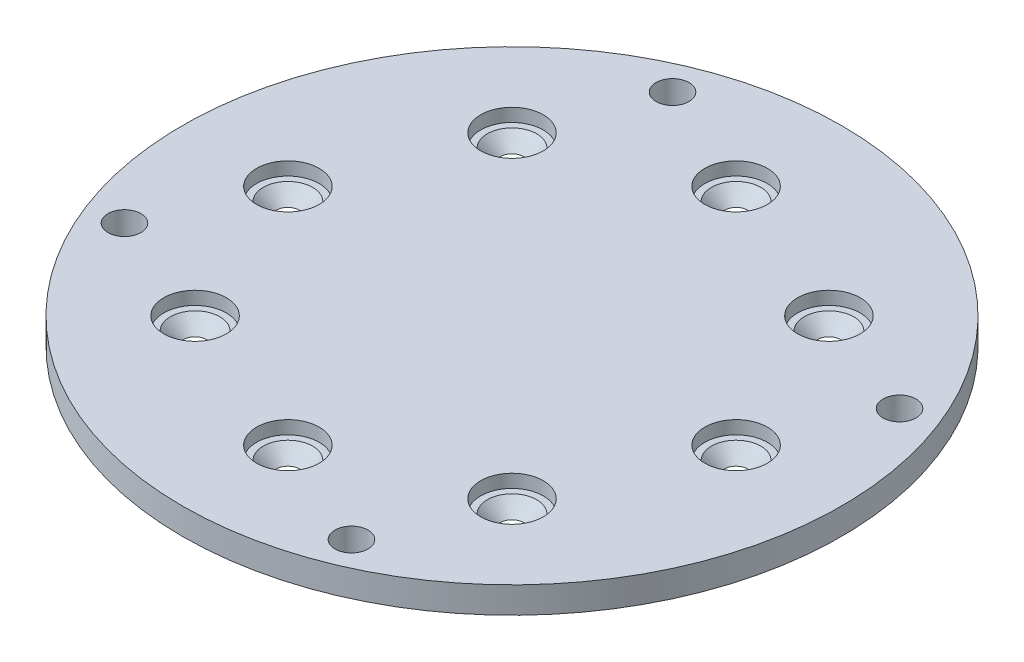
ISO-10303-21;
HEADER;
FILE_DESCRIPTION(('STEP AP214'),'2;1');
FILE_NAME('part.step','',(''),(''),'','','');
FILE_SCHEMA(('AUTOMOTIVE_DESIGN { 1 0 10303 214 1 1 1 1 }'));
ENDSEC;
DATA;
#1=APPLICATION_CONTEXT('core data for automotive mechanical design processes');
#2=APPLICATION_PROTOCOL_DEFINITION('international standard','automotive_design',2000,#1);
#3=PRODUCT_CONTEXT('',#1,'mechanical');
#4=PRODUCT('Part','Part','',(#3));
#5=PRODUCT_RELATED_PRODUCT_CATEGORY('part','',(#4));
#6=PRODUCT_DEFINITION_FORMATION('','',#4);
#7=PRODUCT_DEFINITION_CONTEXT('part definition',#1,'design');
#8=PRODUCT_DEFINITION('design','',#6,#7);
#9=PRODUCT_DEFINITION_SHAPE('','',#8);
#10=(LENGTH_UNIT() NAMED_UNIT(*) SI_UNIT(.MILLI.,.METRE.));
#11=(NAMED_UNIT(*) PLANE_ANGLE_UNIT() SI_UNIT($,.RADIAN.));
#12=(NAMED_UNIT(*) SI_UNIT($,.STERADIAN.) SOLID_ANGLE_UNIT());
#13=UNCERTAINTY_MEASURE_WITH_UNIT(LENGTH_MEASURE(1.E-05),#10,'distance_accuracy_value','');
#14=(GEOMETRIC_REPRESENTATION_CONTEXT(3) GLOBAL_UNCERTAINTY_ASSIGNED_CONTEXT((#13)) GLOBAL_UNIT_ASSIGNED_CONTEXT((#10,
#11,#12)) REPRESENTATION_CONTEXT('',''));
#15=CARTESIAN_POINT('',(0.,0.,0.));
#16=DIRECTION('',(0.,0.,1.));
#17=DIRECTION('',(1.,0.,0.));
#18=AXIS2_PLACEMENT_3D('',#15,#16,#17);
#19=CARTESIAN_POINT('',(0.,4.,0.));
#20=DIRECTION('',(0.,-1.,0.));
#21=DIRECTION('',(0.,0.,-1.));
#22=AXIS2_PLACEMENT_3D('',#19,#20,#21);
#23=PLANE('',#22);
#24=CARTESIAN_POINT('',(0.,4.,34.));
#25=DIRECTION('',(0.,1.,0.));
#26=DIRECTION('',(0.,0.,1.));
#27=AXIS2_PLACEMENT_3D('',#24,#25,#26);
#28=CIRCLE('',#27,4.75);
#29=CARTESIAN_POINT('',(0.,4.,38.75));
#30=VERTEX_POINT('',#29);
#31=EDGE_CURVE('E144',#30,#30,#28,.T.);
#32=ORIENTED_EDGE('',*,*,#31,.F.);
#33=EDGE_LOOP('',(#32));
#34=FACE_BOUND('',#33,.T.);
#35=CARTESIAN_POINT('',(0.,4.,-34.));
#36=DIRECTION('',(0.,1.,0.));
#37=DIRECTION('',(0.,0.,1.));
#38=AXIS2_PLACEMENT_3D('',#35,#36,#37);
#39=CIRCLE('',#38,4.75);
#40=CARTESIAN_POINT('',(0.,4.,-29.25));
#41=VERTEX_POINT('',#40);
#42=EDGE_CURVE('E157',#41,#41,#39,.T.);
#43=ORIENTED_EDGE('',*,*,#42,.F.);
#44=EDGE_LOOP('',(#43));
#45=FACE_BOUND('',#44,.T.);
#46=CARTESIAN_POINT('',(-24.0416305603426,4.,-24.0416305603426));
#47=DIRECTION('',(0.,1.,0.));
#48=DIRECTION('',(0.,0.,1.));
#49=AXIS2_PLACEMENT_3D('',#46,#47,#48);
#50=CIRCLE('',#49,4.75);
#51=CARTESIAN_POINT('',(-24.0416305603426,4.,-19.2916305603426));
#52=VERTEX_POINT('',#51);
#53=EDGE_CURVE('E163',#52,#52,#50,.T.);
#54=ORIENTED_EDGE('',*,*,#53,.F.);
#55=EDGE_LOOP('',(#54));
#56=FACE_BOUND('',#55,.T.);
#57=CARTESIAN_POINT('',(-34.,4.,0.));
#58=DIRECTION('',(0.,1.,0.));
#59=DIRECTION('',(0.,0.,1.));
#60=AXIS2_PLACEMENT_3D('',#57,#58,#59);
#61=CIRCLE('',#60,4.75);
#62=CARTESIAN_POINT('',(-34.,4.,4.75));
#63=VERTEX_POINT('',#62);
#64=EDGE_CURVE('E169',#63,#63,#61,.T.);
#65=ORIENTED_EDGE('',*,*,#64,.F.);
#66=EDGE_LOOP('',(#65));
#67=FACE_BOUND('',#66,.T.);
#68=CARTESIAN_POINT('',(24.0416305603426,4.,24.0416305603426));
#69=DIRECTION('',(0.,1.,0.));
#70=DIRECTION('',(0.,0.,1.));
#71=AXIS2_PLACEMENT_3D('',#68,#69,#70);
#72=CIRCLE('',#71,4.75);
#73=CARTESIAN_POINT('',(24.0416305603426,4.,28.7916305603426));
#74=VERTEX_POINT('',#73);
#75=EDGE_CURVE('E138',#74,#74,#72,.T.);
#76=ORIENTED_EDGE('',*,*,#75,.F.);
#77=EDGE_LOOP('',(#76));
#78=FACE_BOUND('',#77,.T.);
#79=CARTESIAN_POINT('',(34.,4.,0.));
#80=DIRECTION('',(0.,1.,0.));
#81=DIRECTION('',(0.,0.,1.));
#82=AXIS2_PLACEMENT_3D('',#79,#80,#81);
#83=CIRCLE('',#82,4.75);
#84=CARTESIAN_POINT('',(34.,4.,4.75));
#85=VERTEX_POINT('',#84);
#86=EDGE_CURVE('E131',#85,#85,#83,.T.);
#87=ORIENTED_EDGE('',*,*,#86,.F.);
#88=EDGE_LOOP('',(#87));
#89=FACE_BOUND('',#88,.T.);
#90=CARTESIAN_POINT('',(24.0416305603426,4.,-24.0416305603426));
#91=DIRECTION('',(0.,1.,0.));
#92=DIRECTION('',(0.,0.,1.));
#93=AXIS2_PLACEMENT_3D('',#90,#91,#92);
#94=CIRCLE('',#93,4.75);
#95=CARTESIAN_POINT('',(24.0416305603426,4.,-19.2916305603426));
#96=VERTEX_POINT('',#95);
#97=EDGE_CURVE('E152',#96,#96,#94,.T.);
#98=ORIENTED_EDGE('',*,*,#97,.F.);
#99=EDGE_LOOP('',(#98));
#100=FACE_BOUND('',#99,.T.);
#101=CARTESIAN_POINT('',(-24.0416305603426,4.,24.0416305603426));
#102=DIRECTION('',(0.,1.,0.));
#103=DIRECTION('',(0.,0.,1.));
#104=AXIS2_PLACEMENT_3D('',#101,#102,#103);
#105=CIRCLE('',#104,4.75);
#106=CARTESIAN_POINT('',(-24.0416305603426,4.,28.7916305603426));
#107=VERTEX_POINT('',#106);
#108=EDGE_CURVE('E145',#107,#107,#105,.T.);
#109=ORIENTED_EDGE('',*,*,#108,.F.);
#110=EDGE_LOOP('',(#109));
#111=FACE_BOUND('',#110,.T.);
#112=CARTESIAN_POINT('',(17.2207544564314,4.,41.574578963007));
#113=DIRECTION('',(0.,1.,0.));
#114=DIRECTION('',(0.,0.,1.));
#115=AXIS2_PLACEMENT_3D('',#112,#113,#114);
#116=CIRCLE('',#115,2.50000000000286);
#117=CARTESIAN_POINT('',(17.2207544564314,4.,44.0745789630098));
#118=VERTEX_POINT('',#117);
#119=EDGE_CURVE('E90',#118,#118,#116,.T.);
#120=ORIENTED_EDGE('',*,*,#119,.F.);
#121=EDGE_LOOP('',(#120));
#122=FACE_BOUND('',#121,.T.);
#123=CARTESIAN_POINT('',(-41.5745789630062,4.,17.2207544564298));
#124=DIRECTION('',(0.,1.,0.));
#125=DIRECTION('',(0.,0.,1.));
#126=AXIS2_PLACEMENT_3D('',#123,#124,#125);
#127=CIRCLE('',#126,2.50000000000164);
#128=CARTESIAN_POINT('',(-41.5745789630062,4.,19.7207544564314));
#129=VERTEX_POINT('',#128);
#130=EDGE_CURVE('E126',#129,#129,#127,.T.);
#131=ORIENTED_EDGE('',*,*,#130,.F.);
#132=EDGE_LOOP('',(#131));
#133=FACE_BOUND('',#132,.T.);
#134=CARTESIAN_POINT('',(41.5745789630086,4.,-17.2207544564307));
#135=DIRECTION('',(0.,1.,0.));
#136=DIRECTION('',(0.,0.,1.));
#137=AXIS2_PLACEMENT_3D('',#134,#135,#136);
#138=CIRCLE('',#137,2.50000000000153);
#139=CARTESIAN_POINT('',(41.5745789630086,4.,-14.7207544564292));
#140=VERTEX_POINT('',#139);
#141=EDGE_CURVE('E122',#140,#140,#138,.T.);
#142=ORIENTED_EDGE('',*,*,#141,.F.);
#143=EDGE_LOOP('',(#142));
#144=FACE_BOUND('',#143,.T.);
#145=CARTESIAN_POINT('',(-17.2207544564291,4.,-41.5745789630079));
#146=DIRECTION('',(0.,1.,0.));
#147=DIRECTION('',(0.,0.,1.));
#148=AXIS2_PLACEMENT_3D('',#145,#146,#147);
#149=CIRCLE('',#148,2.5);
#150=CARTESIAN_POINT('',(-17.2207544564291,4.,-39.0745789630079));
#151=VERTEX_POINT('',#150);
#152=EDGE_CURVE('E119',#151,#151,#149,.T.);
#153=ORIENTED_EDGE('',*,*,#152,.F.);
#154=EDGE_LOOP('',(#153));
#155=FACE_BOUND('',#154,.T.);
#156=CARTESIAN_POINT('',(0.,4.,0.));
#157=DIRECTION('',(0.,1.,0.));
#158=DIRECTION('',(0.,0.,1.));
#159=AXIS2_PLACEMENT_3D('',#156,#157,#158);
#160=CIRCLE('',#159,50.);
#161=CARTESIAN_POINT('',(0.,4.,50.));
#162=VERTEX_POINT('',#161);
#163=EDGE_CURVE('E80',#162,#162,#160,.T.);
#164=ORIENTED_EDGE('',*,*,#163,.T.);
#165=EDGE_LOOP('',(#164));
#166=FACE_BOUND('',#165,.T.);
#167=ADVANCED_FACE('F43',(#34,#45,#56,#67,#78,#89,#100,#111,#122,#133,#144,#155,#166),#23,.F.);
#168=CARTESIAN_POINT('',(0.,0.,0.));
#169=DIRECTION('',(0.,-1.,0.));
#170=DIRECTION('',(0.,0.,-1.));
#171=AXIS2_PLACEMENT_3D('',#168,#169,#170);
#172=PLANE('',#171);
#173=CARTESIAN_POINT('',(17.2207544564314,0.,41.574578963007));
#174=DIRECTION('',(0.,-1.,0.));
#175=DIRECTION('',(0.,0.,-1.));
#176=AXIS2_PLACEMENT_3D('',#173,#174,#175);
#177=CIRCLE('',#176,2.50000000000286);
#178=CARTESIAN_POINT('',(17.2207544564314,0.,39.0745789630041));
#179=VERTEX_POINT('',#178);
#180=EDGE_CURVE('E77',#179,#179,#177,.T.);
#181=ORIENTED_EDGE('',*,*,#180,.F.);
#182=EDGE_LOOP('',(#181));
#183=FACE_BOUND('',#182,.T.);
#184=CARTESIAN_POINT('',(-41.5745789630062,0.,17.2207544564298));
#185=DIRECTION('',(0.,-1.,0.));
#186=DIRECTION('',(0.,0.,-1.));
#187=AXIS2_PLACEMENT_3D('',#184,#185,#186);
#188=CIRCLE('',#187,2.50000000000164);
#189=CARTESIAN_POINT('',(-41.5745789630062,0.,14.7207544564281));
#190=VERTEX_POINT('',#189);
#191=EDGE_CURVE('E81',#190,#190,#188,.T.);
#192=ORIENTED_EDGE('',*,*,#191,.F.);
#193=EDGE_LOOP('',(#192));
#194=FACE_BOUND('',#193,.T.);
#195=CARTESIAN_POINT('',(41.5745789630086,0.,-17.2207544564307));
#196=DIRECTION('',(0.,-1.,0.));
#197=DIRECTION('',(0.,0.,-1.));
#198=AXIS2_PLACEMENT_3D('',#195,#196,#197);
#199=CIRCLE('',#198,2.50000000000153);
#200=CARTESIAN_POINT('',(41.5745789630086,0.,-19.7207544564323));
#201=VERTEX_POINT('',#200);
#202=EDGE_CURVE('E84',#201,#201,#199,.T.);
#203=ORIENTED_EDGE('',*,*,#202,.F.);
#204=EDGE_LOOP('',(#203));
#205=FACE_BOUND('',#204,.T.);
#206=CARTESIAN_POINT('',(-17.2207544564291,0.,-41.5745789630079));
#207=DIRECTION('',(0.,-1.,0.));
#208=DIRECTION('',(0.,0.,-1.));
#209=AXIS2_PLACEMENT_3D('',#206,#207,#208);
#210=CIRCLE('',#209,2.5);
#211=CARTESIAN_POINT('',(-17.2207544564291,0.,-44.0745789630079));
#212=VERTEX_POINT('',#211);
#213=EDGE_CURVE('E87',#212,#212,#210,.T.);
#214=ORIENTED_EDGE('',*,*,#213,.F.);
#215=EDGE_LOOP('',(#214));
#216=FACE_BOUND('',#215,.T.);
#217=CARTESIAN_POINT('',(-34.,0.,0.));
#218=DIRECTION('',(0.,-1.,0.));
#219=DIRECTION('',(0.,0.,-1.));
#220=AXIS2_PLACEMENT_3D('',#217,#218,#219);
#221=CIRCLE('',#220,1.75);
#222=CARTESIAN_POINT('',(-34.,0.,-1.75));
#223=VERTEX_POINT('',#222);
#224=EDGE_CURVE('E93',#223,#223,#221,.T.);
#225=ORIENTED_EDGE('',*,*,#224,.F.);
#226=EDGE_LOOP('',(#225));
#227=FACE_BOUND('',#226,.T.);
#228=CARTESIAN_POINT('',(24.0416305603426,0.,-24.0416305603426));
#229=DIRECTION('',(0.,-1.,0.));
#230=DIRECTION('',(0.,0.,-1.));
#231=AXIS2_PLACEMENT_3D('',#228,#229,#230);
#232=CIRCLE('',#231,1.75);
#233=CARTESIAN_POINT('',(24.0416305603426,0.,-25.7916305603426));
#234=VERTEX_POINT('',#233);
#235=EDGE_CURVE('E96',#234,#234,#232,.T.);
#236=ORIENTED_EDGE('',*,*,#235,.F.);
#237=EDGE_LOOP('',(#236));
#238=FACE_BOUND('',#237,.T.);
#239=CARTESIAN_POINT('',(0.,0.,-34.));
#240=DIRECTION('',(0.,-1.,0.));
#241=DIRECTION('',(0.,0.,-1.));
#242=AXIS2_PLACEMENT_3D('',#239,#240,#241);
#243=CIRCLE('',#242,1.75);
#244=CARTESIAN_POINT('',(0.,0.,-35.75));
#245=VERTEX_POINT('',#244);
#246=EDGE_CURVE('E99',#245,#245,#243,.T.);
#247=ORIENTED_EDGE('',*,*,#246,.F.);
#248=EDGE_LOOP('',(#247));
#249=FACE_BOUND('',#248,.T.);
#250=CARTESIAN_POINT('',(-24.0416305603426,0.,-24.0416305603426));
#251=DIRECTION('',(0.,-1.,0.));
#252=DIRECTION('',(0.,0.,-1.));
#253=AXIS2_PLACEMENT_3D('',#250,#251,#252);
#254=CIRCLE('',#253,1.75);
#255=CARTESIAN_POINT('',(-24.0416305603426,0.,-25.7916305603426));
#256=VERTEX_POINT('',#255);
#257=EDGE_CURVE('E102',#256,#256,#254,.T.);
#258=ORIENTED_EDGE('',*,*,#257,.F.);
#259=EDGE_LOOP('',(#258));
#260=FACE_BOUND('',#259,.T.);
#261=CARTESIAN_POINT('',(34.,0.,0.));
#262=DIRECTION('',(0.,-1.,0.));
#263=DIRECTION('',(0.,0.,-1.));
#264=AXIS2_PLACEMENT_3D('',#261,#262,#263);
#265=CIRCLE('',#264,1.75);
#266=CARTESIAN_POINT('',(34.,0.,-1.75000000000001));
#267=VERTEX_POINT('',#266);
#268=EDGE_CURVE('E105',#267,#267,#265,.T.);
#269=ORIENTED_EDGE('',*,*,#268,.F.);
#270=EDGE_LOOP('',(#269));
#271=FACE_BOUND('',#270,.T.);
#272=CARTESIAN_POINT('',(24.0416305603426,0.,24.0416305603426));
#273=DIRECTION('',(0.,-1.,0.));
#274=DIRECTION('',(0.,0.,-1.));
#275=AXIS2_PLACEMENT_3D('',#272,#273,#274);
#276=CIRCLE('',#275,1.75);
#277=CARTESIAN_POINT('',(24.0416305603426,0.,22.2916305603426));
#278=VERTEX_POINT('',#277);
#279=EDGE_CURVE('E108',#278,#278,#276,.T.);
#280=ORIENTED_EDGE('',*,*,#279,.F.);
#281=EDGE_LOOP('',(#280));
#282=FACE_BOUND('',#281,.T.);
#283=CARTESIAN_POINT('',(0.,0.,34.));
#284=DIRECTION('',(0.,-1.,0.));
#285=DIRECTION('',(0.,0.,-1.));
#286=AXIS2_PLACEMENT_3D('',#283,#284,#285);
#287=CIRCLE('',#286,1.75);
#288=CARTESIAN_POINT('',(0.,0.,32.25));
#289=VERTEX_POINT('',#288);
#290=EDGE_CURVE('E111',#289,#289,#287,.T.);
#291=ORIENTED_EDGE('',*,*,#290,.F.);
#292=EDGE_LOOP('',(#291));
#293=FACE_BOUND('',#292,.T.);
#294=CARTESIAN_POINT('',(-24.0416305603426,0.,24.0416305603426));
#295=DIRECTION('',(0.,-1.,0.));
#296=DIRECTION('',(0.,0.,-1.));
#297=AXIS2_PLACEMENT_3D('',#294,#295,#296);
#298=CIRCLE('',#297,1.75);
#299=CARTESIAN_POINT('',(-24.0416305603426,0.,22.2916305603426));
#300=VERTEX_POINT('',#299);
#301=EDGE_CURVE('E114',#300,#300,#298,.T.);
#302=ORIENTED_EDGE('',*,*,#301,.F.);
#303=EDGE_LOOP('',(#302));
#304=FACE_BOUND('',#303,.T.);
#305=CARTESIAN_POINT('',(0.,0.,0.));
#306=DIRECTION('',(0.,-1.,0.));
#307=DIRECTION('',(0.,0.,-1.));
#308=AXIS2_PLACEMENT_3D('',#305,#306,#307);
#309=CIRCLE('',#308,50.);
#310=CARTESIAN_POINT('',(0.,0.,-50.));
#311=VERTEX_POINT('',#310);
#312=EDGE_CURVE('E76',#311,#311,#309,.T.);
#313=ORIENTED_EDGE('',*,*,#312,.T.);
#314=EDGE_LOOP('',(#313));
#315=FACE_BOUND('',#314,.T.);
#316=ADVANCED_FACE('F190',(#183,#194,#205,#216,#227,#238,#249,#260,#271,#282,#293,#304,#315),
#172,.T.);
#317=CARTESIAN_POINT('',(0.,-6.,0.));
#318=DIRECTION('',(0.,1.,0.));
#319=DIRECTION('',(0.,0.,1.));
#320=AXIS2_PLACEMENT_3D('',#317,#318,#319);
#321=CYLINDRICAL_SURFACE('',#320,50.);
#322=ORIENTED_EDGE('',*,*,#163,.F.);
#323=EDGE_LOOP('',(#322));
#324=FACE_BOUND('',#323,.T.);
#325=ORIENTED_EDGE('',*,*,#312,.F.);
#326=EDGE_LOOP('',(#325));
#327=FACE_BOUND('',#326,.T.);
#328=ADVANCED_FACE('F216',(#324,#327),#321,.T.);
#329=CARTESIAN_POINT('',(-17.2207544564291,-6.,-41.5745789630079));
#330=DIRECTION('',(0.,1.,0.));
#331=DIRECTION('',(0.,0.,1.));
#332=AXIS2_PLACEMENT_3D('',#329,#330,#331);
#333=CYLINDRICAL_SURFACE('',#332,2.5);
#334=ORIENTED_EDGE('',*,*,#213,.T.);
#335=EDGE_LOOP('',(#334));
#336=FACE_BOUND('',#335,.T.);
#337=ORIENTED_EDGE('',*,*,#152,.T.);
#338=EDGE_LOOP('',(#337));
#339=FACE_BOUND('',#338,.T.);
#340=ADVANCED_FACE('F219',(#336,#339),#333,.F.);
#341=CARTESIAN_POINT('',(41.5745789630086,-6.,-17.2207544564307));
#342=DIRECTION('',(0.,1.,0.));
#343=DIRECTION('',(0.,0.,1.));
#344=AXIS2_PLACEMENT_3D('',#341,#342,#343);
#345=CYLINDRICAL_SURFACE('',#344,2.50000000000153);
#346=ORIENTED_EDGE('',*,*,#202,.T.);
#347=EDGE_LOOP('',(#346));
#348=FACE_BOUND('',#347,.T.);
#349=ORIENTED_EDGE('',*,*,#141,.T.);
#350=EDGE_LOOP('',(#349));
#351=FACE_BOUND('',#350,.T.);
#352=ADVANCED_FACE('F334',(#348,#351),#345,.F.);
#353=CARTESIAN_POINT('',(-41.5745789630062,-6.,17.2207544564298));
#354=DIRECTION('',(0.,1.,0.));
#355=DIRECTION('',(0.,0.,1.));
#356=AXIS2_PLACEMENT_3D('',#353,#354,#355);
#357=CYLINDRICAL_SURFACE('',#356,2.50000000000164);
#358=ORIENTED_EDGE('',*,*,#191,.T.);
#359=EDGE_LOOP('',(#358));
#360=FACE_BOUND('',#359,.T.);
#361=ORIENTED_EDGE('',*,*,#130,.T.);
#362=EDGE_LOOP('',(#361));
#363=FACE_BOUND('',#362,.T.);
#364=ADVANCED_FACE('F330',(#360,#363),#357,.F.);
#365=CARTESIAN_POINT('',(17.2207544564314,-6.,41.574578963007));
#366=DIRECTION('',(0.,1.,0.));
#367=DIRECTION('',(0.,0.,1.));
#368=AXIS2_PLACEMENT_3D('',#365,#366,#367);
#369=CYLINDRICAL_SURFACE('',#368,2.50000000000286);
#370=ORIENTED_EDGE('',*,*,#180,.T.);
#371=EDGE_LOOP('',(#370));
#372=FACE_BOUND('',#371,.T.);
#373=ORIENTED_EDGE('',*,*,#119,.T.);
#374=EDGE_LOOP('',(#373));
#375=FACE_BOUND('',#374,.T.);
#376=ADVANCED_FACE('F326',(#372,#375),#369,.F.);
#377=CARTESIAN_POINT('',(-34.,2.,0.));
#378=DIRECTION('',(0.,1.,0.));
#379=DIRECTION('',(0.,0.,1.));
#380=AXIS2_PLACEMENT_3D('',#377,#378,#379);
#381=PLANE('',#380);
#382=CARTESIAN_POINT('',(-34.,2.,0.));
#383=DIRECTION('',(0.,1.,0.));
#384=DIRECTION('',(0.,0.,1.));
#385=AXIS2_PLACEMENT_3D('',#382,#383,#384);
#386=CIRCLE('',#385,3.75000000000003);
#387=CARTESIAN_POINT('',(-34.,2.,3.75000000000003));
#388=VERTEX_POINT('',#387);
#389=EDGE_CURVE('E12',#388,#388,#386,.F.);
#390=ORIENTED_EDGE('',*,*,#389,.T.);
#391=EDGE_LOOP('',(#390));
#392=FACE_BOUND('',#391,.T.);
#393=CARTESIAN_POINT('',(-34.,2.,0.));
#394=DIRECTION('',(0.,1.,0.));
#395=DIRECTION('',(0.,0.,1.));
#396=AXIS2_PLACEMENT_3D('',#393,#394,#395);
#397=CIRCLE('',#396,4.75);
#398=CARTESIAN_POINT('',(-34.,2.,4.75));
#399=VERTEX_POINT('',#398);
#400=EDGE_CURVE('E149',#399,#399,#397,.T.);
#401=ORIENTED_EDGE('',*,*,#400,.T.);
#402=EDGE_LOOP('',(#401));
#403=FACE_BOUND('',#402,.T.);
#404=ADVANCED_FACE('F329',(#392,#403),#381,.T.);
#405=CARTESIAN_POINT('',(-34.,2.,0.));
#406=DIRECTION('',(0.,1.,0.));
#407=DIRECTION('',(0.,0.,1.));
#408=AXIS2_PLACEMENT_3D('',#405,#406,#407);
#409=CYLINDRICAL_SURFACE('',#408,4.75);
#410=ORIENTED_EDGE('',*,*,#400,.F.);
#411=EDGE_LOOP('',(#410));
#412=FACE_BOUND('',#411,.T.);
#413=ORIENTED_EDGE('',*,*,#64,.T.);
#414=EDGE_LOOP('',(#413));
#415=FACE_BOUND('',#414,.T.);
#416=ADVANCED_FACE('F375',(#412,#415),#409,.F.);
#417=CARTESIAN_POINT('',(24.0416305603426,2.,-24.0416305603426));
#418=DIRECTION('',(0.,1.,0.));
#419=DIRECTION('',(0.,0.,1.));
#420=AXIS2_PLACEMENT_3D('',#417,#418,#419);
#421=PLANE('',#420);
#422=CARTESIAN_POINT('',(24.0416305603426,2.,-24.0416305603426));
#423=DIRECTION('',(0.,1.,0.));
#424=DIRECTION('',(0.,0.,1.));
#425=AXIS2_PLACEMENT_3D('',#422,#423,#424);
#426=CIRCLE('',#425,3.74999999999999);
#427=CARTESIAN_POINT('',(24.0416305603426,2.,-20.2916305603426));
#428=VERTEX_POINT('',#427);
#429=EDGE_CURVE('E70',#428,#428,#426,.F.);
#430=ORIENTED_EDGE('',*,*,#429,.T.);
#431=EDGE_LOOP('',(#430));
#432=FACE_BOUND('',#431,.T.);
#433=CARTESIAN_POINT('',(24.0416305603426,2.,-24.0416305603426));
#434=DIRECTION('',(0.,1.,0.));
#435=DIRECTION('',(0.,0.,1.));
#436=AXIS2_PLACEMENT_3D('',#433,#434,#435);
#437=CIRCLE('',#436,4.75);
#438=CARTESIAN_POINT('',(24.0416305603426,2.,-19.2916305603426));
#439=VERTEX_POINT('',#438);
#440=EDGE_CURVE('E135',#439,#439,#437,.T.);
#441=ORIENTED_EDGE('',*,*,#440,.T.);
#442=EDGE_LOOP('',(#441));
#443=FACE_BOUND('',#442,.T.);
#444=ADVANCED_FACE('F373',(#432,#443),#421,.T.);
#445=CARTESIAN_POINT('',(24.0416305603426,2.,-24.0416305603426));
#446=DIRECTION('',(0.,1.,0.));
#447=DIRECTION('',(0.,0.,1.));
#448=AXIS2_PLACEMENT_3D('',#445,#446,#447);
#449=CYLINDRICAL_SURFACE('',#448,4.75);
#450=ORIENTED_EDGE('',*,*,#440,.F.);
#451=EDGE_LOOP('',(#450));
#452=FACE_BOUND('',#451,.T.);
#453=ORIENTED_EDGE('',*,*,#97,.T.);
#454=EDGE_LOOP('',(#453));
#455=FACE_BOUND('',#454,.T.);
#456=ADVANCED_FACE('F359',(#452,#455),#449,.F.);
#457=CARTESIAN_POINT('',(0.,2.,-34.));
#458=DIRECTION('',(0.,1.,0.));
#459=DIRECTION('',(0.,0.,1.));
#460=AXIS2_PLACEMENT_3D('',#457,#458,#459);
#461=PLANE('',#460);
#462=CARTESIAN_POINT('',(0.,2.,-34.));
#463=DIRECTION('',(0.,1.,0.));
#464=DIRECTION('',(0.,0.,1.));
#465=AXIS2_PLACEMENT_3D('',#462,#463,#464);
#466=CIRCLE('',#465,3.74999999999999);
#467=CARTESIAN_POINT('',(0.,2.,-30.25));
#468=VERTEX_POINT('',#467);
#469=EDGE_CURVE('E73',#468,#468,#466,.F.);
#470=ORIENTED_EDGE('',*,*,#469,.T.);
#471=EDGE_LOOP('',(#470));
#472=FACE_BOUND('',#471,.T.);
#473=CARTESIAN_POINT('',(0.,2.,-34.));
#474=DIRECTION('',(0.,1.,0.));
#475=DIRECTION('',(0.,0.,1.));
#476=AXIS2_PLACEMENT_3D('',#473,#474,#475);
#477=CIRCLE('',#476,4.75);
#478=CARTESIAN_POINT('',(0.,2.,-29.25));
#479=VERTEX_POINT('',#478);
#480=EDGE_CURVE('E160',#479,#479,#477,.T.);
#481=ORIENTED_EDGE('',*,*,#480,.T.);
#482=EDGE_LOOP('',(#481));
#483=FACE_BOUND('',#482,.T.);
#484=ADVANCED_FACE('F355',(#472,#483),#461,.T.);
#485=CARTESIAN_POINT('',(0.,2.,-34.));
#486=DIRECTION('',(0.,1.,0.));
#487=DIRECTION('',(0.,0.,1.));
#488=AXIS2_PLACEMENT_3D('',#485,#486,#487);
#489=CYLINDRICAL_SURFACE('',#488,4.75);
#490=ORIENTED_EDGE('',*,*,#480,.F.);
#491=EDGE_LOOP('',(#490));
#492=FACE_BOUND('',#491,.T.);
#493=ORIENTED_EDGE('',*,*,#42,.T.);
#494=EDGE_LOOP('',(#493));
#495=FACE_BOUND('',#494,.T.);
#496=ADVANCED_FACE('F358',(#492,#495),#489,.F.);
#497=CARTESIAN_POINT('',(-24.0416305603426,2.,-24.0416305603426));
#498=DIRECTION('',(0.,1.,0.));
#499=DIRECTION('',(0.,0.,1.));
#500=AXIS2_PLACEMENT_3D('',#497,#498,#499);
#501=PLANE('',#500);
#502=CARTESIAN_POINT('',(-24.0416305603426,2.,-24.0416305603426));
#503=DIRECTION('',(0.,1.,0.));
#504=DIRECTION('',(0.,0.,1.));
#505=AXIS2_PLACEMENT_3D('',#502,#503,#504);
#506=CIRCLE('',#505,3.74999999999999);
#507=CARTESIAN_POINT('',(-24.0416305603426,2.,-20.2916305603426));
#508=VERTEX_POINT('',#507);
#509=EDGE_CURVE('E51',#508,#508,#506,.F.);
#510=ORIENTED_EDGE('',*,*,#509,.T.);
#511=EDGE_LOOP('',(#510));
#512=FACE_BOUND('',#511,.T.);
#513=CARTESIAN_POINT('',(-24.0416305603426,2.,-24.0416305603426));
#514=DIRECTION('',(0.,1.,0.));
#515=DIRECTION('',(0.,0.,1.));
#516=AXIS2_PLACEMENT_3D('',#513,#514,#515);
#517=CIRCLE('',#516,4.75);
#518=CARTESIAN_POINT('',(-24.0416305603426,2.,-19.2916305603426));
#519=VERTEX_POINT('',#518);
#520=EDGE_CURVE('E166',#519,#519,#517,.T.);
#521=ORIENTED_EDGE('',*,*,#520,.T.);
#522=EDGE_LOOP('',(#521));
#523=FACE_BOUND('',#522,.T.);
#524=ADVANCED_FACE('F365',(#512,#523),#501,.T.);
#525=CARTESIAN_POINT('',(-24.0416305603426,2.,-24.0416305603426));
#526=DIRECTION('',(0.,1.,0.));
#527=DIRECTION('',(0.,0.,1.));
#528=AXIS2_PLACEMENT_3D('',#525,#526,#527);
#529=CYLINDRICAL_SURFACE('',#528,4.75);
#530=ORIENTED_EDGE('',*,*,#520,.F.);
#531=EDGE_LOOP('',(#530));
#532=FACE_BOUND('',#531,.T.);
#533=ORIENTED_EDGE('',*,*,#53,.T.);
#534=EDGE_LOOP('',(#533));
#535=FACE_BOUND('',#534,.T.);
#536=ADVANCED_FACE('F321',(#532,#535),#529,.F.);
#537=CARTESIAN_POINT('',(34.,2.,0.));
#538=DIRECTION('',(0.,1.,0.));
#539=DIRECTION('',(0.,0.,1.));
#540=AXIS2_PLACEMENT_3D('',#537,#538,#539);
#541=PLANE('',#540);
#542=CARTESIAN_POINT('',(34.,2.,0.));
#543=DIRECTION('',(0.,1.,0.));
#544=DIRECTION('',(0.,0.,1.));
#545=AXIS2_PLACEMENT_3D('',#542,#543,#544);
#546=CIRCLE('',#545,3.75000000000003);
#547=CARTESIAN_POINT('',(34.,2.,3.75000000000003));
#548=VERTEX_POINT('',#547);
#549=EDGE_CURVE('E67',#548,#548,#546,.F.);
#550=ORIENTED_EDGE('',*,*,#549,.T.);
#551=EDGE_LOOP('',(#550));
#552=FACE_BOUND('',#551,.T.);
#553=CARTESIAN_POINT('',(34.,2.,0.));
#554=DIRECTION('',(0.,1.,0.));
#555=DIRECTION('',(0.,0.,1.));
#556=AXIS2_PLACEMENT_3D('',#553,#554,#555);
#557=CIRCLE('',#556,4.75);
#558=CARTESIAN_POINT('',(34.,2.,4.75));
#559=VERTEX_POINT('',#558);
#560=EDGE_CURVE('E134',#559,#559,#557,.T.);
#561=ORIENTED_EDGE('',*,*,#560,.T.);
#562=EDGE_LOOP('',(#561));
#563=FACE_BOUND('',#562,.T.);
#564=ADVANCED_FACE('F318',(#552,#563),#541,.T.);
#565=CARTESIAN_POINT('',(34.,2.,0.));
#566=DIRECTION('',(0.,1.,0.));
#567=DIRECTION('',(0.,0.,1.));
#568=AXIS2_PLACEMENT_3D('',#565,#566,#567);
#569=CYLINDRICAL_SURFACE('',#568,4.75);
#570=ORIENTED_EDGE('',*,*,#560,.F.);
#571=EDGE_LOOP('',(#570));
#572=FACE_BOUND('',#571,.T.);
#573=ORIENTED_EDGE('',*,*,#86,.T.);
#574=EDGE_LOOP('',(#573));
#575=FACE_BOUND('',#574,.T.);
#576=ADVANCED_FACE('F313',(#572,#575),#569,.F.);
#577=CARTESIAN_POINT('',(24.0416305603426,2.,24.0416305603426));
#578=DIRECTION('',(0.,1.,0.));
#579=DIRECTION('',(0.,0.,1.));
#580=AXIS2_PLACEMENT_3D('',#577,#578,#579);
#581=PLANE('',#580);
#582=CARTESIAN_POINT('',(24.0416305603426,2.,24.0416305603426));
#583=DIRECTION('',(0.,1.,0.));
#584=DIRECTION('',(0.,0.,1.));
#585=AXIS2_PLACEMENT_3D('',#582,#583,#584);
#586=CIRCLE('',#585,3.74999999999999);
#587=CARTESIAN_POINT('',(24.0416305603426,2.,27.7916305603426));
#588=VERTEX_POINT('',#587);
#589=EDGE_CURVE('E64',#588,#588,#586,.F.);
#590=ORIENTED_EDGE('',*,*,#589,.T.);
#591=EDGE_LOOP('',(#590));
#592=FACE_BOUND('',#591,.T.);
#593=CARTESIAN_POINT('',(24.0416305603426,2.,24.0416305603426));
#594=DIRECTION('',(0.,1.,0.));
#595=DIRECTION('',(0.,0.,1.));
#596=AXIS2_PLACEMENT_3D('',#593,#594,#595);
#597=CIRCLE('',#596,4.75);
#598=CARTESIAN_POINT('',(24.0416305603426,2.,28.7916305603426));
#599=VERTEX_POINT('',#598);
#600=EDGE_CURVE('E141',#599,#599,#597,.T.);
#601=ORIENTED_EDGE('',*,*,#600,.T.);
#602=EDGE_LOOP('',(#601));
#603=FACE_BOUND('',#602,.T.);
#604=ADVANCED_FACE('F309',(#592,#603),#581,.T.);
#605=CARTESIAN_POINT('',(24.0416305603426,2.,24.0416305603426));
#606=DIRECTION('',(0.,1.,0.));
#607=DIRECTION('',(0.,0.,1.));
#608=AXIS2_PLACEMENT_3D('',#605,#606,#607);
#609=CYLINDRICAL_SURFACE('',#608,4.75);
#610=ORIENTED_EDGE('',*,*,#600,.F.);
#611=EDGE_LOOP('',(#610));
#612=FACE_BOUND('',#611,.T.);
#613=ORIENTED_EDGE('',*,*,#75,.T.);
#614=EDGE_LOOP('',(#613));
#615=FACE_BOUND('',#614,.T.);
#616=ADVANCED_FACE('F312',(#612,#615),#609,.F.);
#617=CARTESIAN_POINT('',(0.,2.,34.));
#618=DIRECTION('',(0.,1.,0.));
#619=DIRECTION('',(0.,0.,1.));
#620=AXIS2_PLACEMENT_3D('',#617,#618,#619);
#621=PLANE('',#620);
#622=CARTESIAN_POINT('',(0.,2.,34.));
#623=DIRECTION('',(0.,1.,0.));
#624=DIRECTION('',(0.,0.,1.));
#625=AXIS2_PLACEMENT_3D('',#622,#623,#624);
#626=CIRCLE('',#625,3.74999999999999);
#627=CARTESIAN_POINT('',(0.,2.,37.75));
#628=VERTEX_POINT('',#627);
#629=EDGE_CURVE('E59',#628,#628,#626,.F.);
#630=ORIENTED_EDGE('',*,*,#629,.T.);
#631=EDGE_LOOP('',(#630));
#632=FACE_BOUND('',#631,.T.);
#633=CARTESIAN_POINT('',(0.,2.,34.));
#634=DIRECTION('',(0.,1.,0.));
#635=DIRECTION('',(0.,0.,1.));
#636=AXIS2_PLACEMENT_3D('',#633,#634,#635);
#637=CIRCLE('',#636,4.75);
#638=CARTESIAN_POINT('',(0.,2.,38.75));
#639=VERTEX_POINT('',#638);
#640=EDGE_CURVE('E123',#639,#639,#637,.T.);
#641=ORIENTED_EDGE('',*,*,#640,.T.);
#642=EDGE_LOOP('',(#641));
#643=FACE_BOUND('',#642,.T.);
#644=ADVANCED_FACE('F179',(#632,#643),#621,.T.);
#645=CARTESIAN_POINT('',(0.,2.,34.));
#646=DIRECTION('',(0.,1.,0.));
#647=DIRECTION('',(0.,0.,1.));
#648=AXIS2_PLACEMENT_3D('',#645,#646,#647);
#649=CYLINDRICAL_SURFACE('',#648,4.75);
#650=ORIENTED_EDGE('',*,*,#640,.F.);
#651=EDGE_LOOP('',(#650));
#652=FACE_BOUND('',#651,.T.);
#653=ORIENTED_EDGE('',*,*,#31,.T.);
#654=EDGE_LOOP('',(#653));
#655=FACE_BOUND('',#654,.T.);
#656=ADVANCED_FACE('F181',(#652,#655),#649,.F.);
#657=CARTESIAN_POINT('',(-24.0416305603426,2.,24.0416305603426));
#658=DIRECTION('',(0.,1.,0.));
#659=DIRECTION('',(0.,0.,1.));
#660=AXIS2_PLACEMENT_3D('',#657,#658,#659);
#661=PLANE('',#660);
#662=CARTESIAN_POINT('',(-24.0416305603426,2.,24.0416305603426));
#663=DIRECTION('',(0.,1.,0.));
#664=DIRECTION('',(0.,0.,1.));
#665=AXIS2_PLACEMENT_3D('',#662,#663,#664);
#666=CIRCLE('',#665,3.75000000000003);
#667=CARTESIAN_POINT('',(-24.0416305603426,2.,27.7916305603427));
#668=VERTEX_POINT('',#667);
#669=EDGE_CURVE('E55',#668,#668,#666,.F.);
#670=ORIENTED_EDGE('',*,*,#669,.T.);
#671=EDGE_LOOP('',(#670));
#672=FACE_BOUND('',#671,.T.);
#673=CARTESIAN_POINT('',(-24.0416305603426,2.,24.0416305603426));
#674=DIRECTION('',(0.,1.,0.));
#675=DIRECTION('',(0.,0.,1.));
#676=AXIS2_PLACEMENT_3D('',#673,#674,#675);
#677=CIRCLE('',#676,4.75);
#678=CARTESIAN_POINT('',(-24.0416305603426,2.,28.7916305603426));
#679=VERTEX_POINT('',#678);
#680=EDGE_CURVE('E148',#679,#679,#677,.T.);
#681=ORIENTED_EDGE('',*,*,#680,.T.);
#682=EDGE_LOOP('',(#681));
#683=FACE_BOUND('',#682,.T.);
#684=ADVANCED_FACE('F184',(#672,#683),#661,.T.);
#685=CARTESIAN_POINT('',(-24.0416305603426,2.,24.0416305603426));
#686=DIRECTION('',(0.,1.,0.));
#687=DIRECTION('',(0.,0.,1.));
#688=AXIS2_PLACEMENT_3D('',#685,#686,#687);
#689=CYLINDRICAL_SURFACE('',#688,4.75);
#690=ORIENTED_EDGE('',*,*,#680,.F.);
#691=EDGE_LOOP('',(#690));
#692=FACE_BOUND('',#691,.T.);
#693=ORIENTED_EDGE('',*,*,#108,.T.);
#694=EDGE_LOOP('',(#693));
#695=FACE_BOUND('',#694,.T.);
#696=ADVANCED_FACE('F239',(#692,#695),#689,.F.);
#697=CARTESIAN_POINT('',(0.,2.,-34.));
#698=DIRECTION('',(0.,1.,0.));
#699=DIRECTION('',(0.,0.,1.));
#700=AXIS2_PLACEMENT_3D('',#697,#698,#699);
#701=CONICAL_SURFACE('',#700,3.74999999999999,0.785398163397446);
#702=ORIENTED_EDGE('',*,*,#246,.T.);
#703=EDGE_LOOP('',(#702));
#704=FACE_BOUND('',#703,.T.);
#705=ORIENTED_EDGE('',*,*,#469,.F.);
#706=EDGE_LOOP('',(#705));
#707=FACE_BOUND('',#706,.T.);
#708=ADVANCED_FACE('F232',(#704,#707),#701,.F.);
#709=CARTESIAN_POINT('',(24.0416305603426,2.,-24.0416305603426));
#710=DIRECTION('',(0.,1.,0.));
#711=DIRECTION('',(0.,0.,1.));
#712=AXIS2_PLACEMENT_3D('',#709,#710,#711);
#713=CONICAL_SURFACE('',#712,3.74999999999999,0.785398163397446);
#714=ORIENTED_EDGE('',*,*,#235,.T.);
#715=EDGE_LOOP('',(#714));
#716=FACE_BOUND('',#715,.T.);
#717=ORIENTED_EDGE('',*,*,#429,.F.);
#718=EDGE_LOOP('',(#717));
#719=FACE_BOUND('',#718,.T.);
#720=ADVANCED_FACE('F238',(#716,#719),#713,.F.);
#721=CARTESIAN_POINT('',(34.,2.,0.));
#722=DIRECTION('',(0.,1.,0.));
#723=DIRECTION('',(0.,0.,1.));
#724=AXIS2_PLACEMENT_3D('',#721,#722,#723);
#725=CONICAL_SURFACE('',#724,3.75000000000003,0.785398163397446);
#726=ORIENTED_EDGE('',*,*,#268,.T.);
#727=EDGE_LOOP('',(#726));
#728=FACE_BOUND('',#727,.T.);
#729=ORIENTED_EDGE('',*,*,#549,.F.);
#730=EDGE_LOOP('',(#729));
#731=FACE_BOUND('',#730,.T.);
#732=ADVANCED_FACE('F246',(#728,#731),#725,.F.);
#733=CARTESIAN_POINT('',(24.0416305603426,2.,24.0416305603426));
#734=DIRECTION('',(0.,1.,0.));
#735=DIRECTION('',(0.,0.,1.));
#736=AXIS2_PLACEMENT_3D('',#733,#734,#735);
#737=CONICAL_SURFACE('',#736,3.74999999999999,0.785398163397446);
#738=ORIENTED_EDGE('',*,*,#279,.T.);
#739=EDGE_LOOP('',(#738));
#740=FACE_BOUND('',#739,.T.);
#741=ORIENTED_EDGE('',*,*,#589,.F.);
#742=EDGE_LOOP('',(#741));
#743=FACE_BOUND('',#742,.T.);
#744=ADVANCED_FACE('F253',(#740,#743),#737,.F.);
#745=CARTESIAN_POINT('',(0.,2.,34.));
#746=DIRECTION('',(0.,1.,0.));
#747=DIRECTION('',(0.,0.,1.));
#748=AXIS2_PLACEMENT_3D('',#745,#746,#747);
#749=CONICAL_SURFACE('',#748,3.74999999999999,0.785398163397446);
#750=ORIENTED_EDGE('',*,*,#290,.T.);
#751=EDGE_LOOP('',(#750));
#752=FACE_BOUND('',#751,.T.);
#753=ORIENTED_EDGE('',*,*,#629,.F.);
#754=EDGE_LOOP('',(#753));
#755=FACE_BOUND('',#754,.T.);
#756=ADVANCED_FACE('F260',(#752,#755),#749,.F.);
#757=CARTESIAN_POINT('',(-24.0416305603426,2.,24.0416305603426));
#758=DIRECTION('',(0.,1.,0.));
#759=DIRECTION('',(0.,0.,1.));
#760=AXIS2_PLACEMENT_3D('',#757,#758,#759);
#761=CONICAL_SURFACE('',#760,3.75000000000003,0.785398163397446);
#762=ORIENTED_EDGE('',*,*,#301,.T.);
#763=EDGE_LOOP('',(#762));
#764=FACE_BOUND('',#763,.T.);
#765=ORIENTED_EDGE('',*,*,#669,.F.);
#766=EDGE_LOOP('',(#765));
#767=FACE_BOUND('',#766,.T.);
#768=ADVANCED_FACE('F267',(#764,#767),#761,.F.);
#769=CARTESIAN_POINT('',(-24.0416305603426,2.,-24.0416305603426));
#770=DIRECTION('',(0.,1.,0.));
#771=DIRECTION('',(0.,0.,1.));
#772=AXIS2_PLACEMENT_3D('',#769,#770,#771);
#773=CONICAL_SURFACE('',#772,3.74999999999999,0.785398163397446);
#774=ORIENTED_EDGE('',*,*,#257,.T.);
#775=EDGE_LOOP('',(#774));
#776=FACE_BOUND('',#775,.T.);
#777=ORIENTED_EDGE('',*,*,#509,.F.);
#778=EDGE_LOOP('',(#777));
#779=FACE_BOUND('',#778,.T.);
#780=ADVANCED_FACE('F273',(#776,#779),#773,.F.);
#781=CARTESIAN_POINT('',(-34.,2.,0.));
#782=DIRECTION('',(0.,1.,0.));
#783=DIRECTION('',(0.,0.,1.));
#784=AXIS2_PLACEMENT_3D('',#781,#782,#783);
#785=CONICAL_SURFACE('',#784,3.75000000000003,0.785398163397446);
#786=ORIENTED_EDGE('',*,*,#224,.T.);
#787=EDGE_LOOP('',(#786));
#788=FACE_BOUND('',#787,.T.);
#789=ORIENTED_EDGE('',*,*,#389,.F.);
#790=EDGE_LOOP('',(#789));
#791=FACE_BOUND('',#790,.T.);
#792=ADVANCED_FACE('F46',(#788,#791),#785,.F.);
#793=CLOSED_SHELL('',(#167,#316,#328,#340,#352,#364,#376,#404,#416,#444,#456,#484,#496,#524,
#536,#564,#576,#604,#616,#644,#656,#684,#696,#708,#720,#732,#744,#756,#768,#780,#792));
#794=MANIFOLD_SOLID_BREP('B2',#793);
#795=ADVANCED_BREP_SHAPE_REPRESENTATION('',(#18,#794),#14);
#796=SHAPE_DEFINITION_REPRESENTATION(#9,#795);
ENDSEC;
END-ISO-10303-21;
